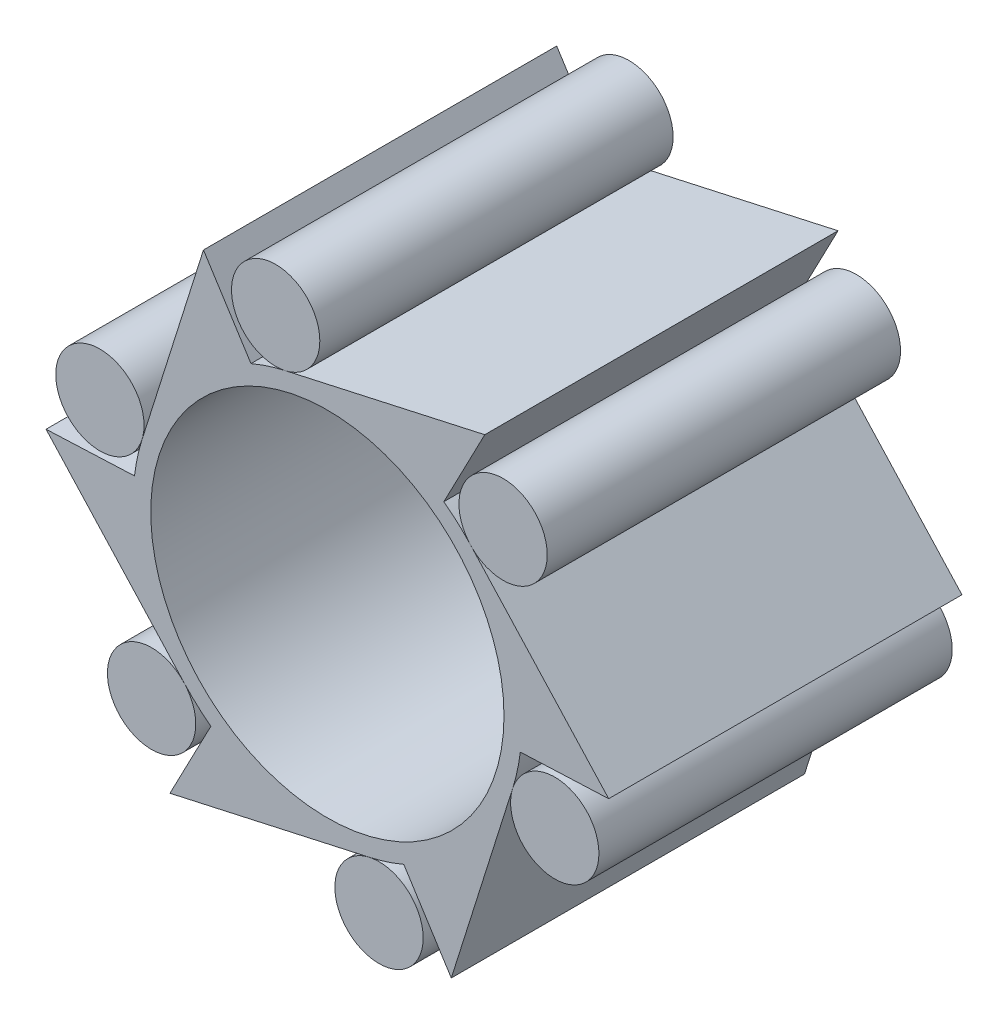
ISO-10303-21;
HEADER;
FILE_DESCRIPTION(('STEP AP214'),'2;1');
FILE_NAME('part.step','',(''),(''),'','','');
FILE_SCHEMA(('AUTOMOTIVE_DESIGN { 1 0 10303 214 1 1 1 1 }'));
ENDSEC;
DATA;
#1=APPLICATION_CONTEXT('core data for automotive mechanical design processes');
#2=APPLICATION_PROTOCOL_DEFINITION('international standard','automotive_design',2000,#1);
#3=PRODUCT_CONTEXT('',#1,'mechanical');
#4=PRODUCT('Part','Part','',(#3));
#5=PRODUCT_RELATED_PRODUCT_CATEGORY('part','',(#4));
#6=PRODUCT_DEFINITION_FORMATION('','',#4);
#7=PRODUCT_DEFINITION_CONTEXT('part definition',#1,'design');
#8=PRODUCT_DEFINITION('design','',#6,#7);
#9=PRODUCT_DEFINITION_SHAPE('','',#8);
#10=(LENGTH_UNIT() NAMED_UNIT(*) SI_UNIT(.MILLI.,.METRE.));
#11=(NAMED_UNIT(*) PLANE_ANGLE_UNIT() SI_UNIT($,.RADIAN.));
#12=(NAMED_UNIT(*) SI_UNIT($,.STERADIAN.) SOLID_ANGLE_UNIT());
#13=UNCERTAINTY_MEASURE_WITH_UNIT(LENGTH_MEASURE(1.E-05),#10,'distance_accuracy_value','');
#14=(GEOMETRIC_REPRESENTATION_CONTEXT(3) GLOBAL_UNCERTAINTY_ASSIGNED_CONTEXT((#13)) GLOBAL_UNIT_ASSIGNED_CONTEXT((#10,
#11,#12)) REPRESENTATION_CONTEXT('',''));
#15=CARTESIAN_POINT('',(0.,0.,0.));
#16=DIRECTION('',(0.,0.,1.));
#17=DIRECTION('',(1.,0.,0.));
#18=AXIS2_PLACEMENT_3D('',#15,#16,#17);
#19=CARTESIAN_POINT('',(-6.43815847656184,2.02795843908887,0.));
#20=DIRECTION('',(0.,0.,1.));
#21=DIRECTION('',(1.,0.,0.));
#22=AXIS2_PLACEMENT_3D('',#19,#20,#21);
#23=CYLINDRICAL_SURFACE('',#22,1.25000000000029);
#24=CARTESIAN_POINT('',(-6.43815847656184,2.02795843908887,0.));
#25=DIRECTION('',(0.,0.,1.));
#26=DIRECTION('',(1.,0.,0.));
#27=AXIS2_PLACEMENT_3D('',#24,#25,#26);
#28=CIRCLE('',#27,1.25000000000029);
#29=CARTESIAN_POINT('',(-5.18815847656156,2.02795843908887,0.));
#30=VERTEX_POINT('',#29);
#31=EDGE_CURVE('E11',#30,#30,#28,.T.);
#32=ORIENTED_EDGE('',*,*,#31,.T.);
#33=EDGE_LOOP('',(#32));
#34=FACE_BOUND('',#33,.T.);
#35=CARTESIAN_POINT('',(-6.43815847656184,2.02795843908887,10.001));
#36=DIRECTION('',(0.,0.,1.));
#37=DIRECTION('',(1.,0.,0.));
#38=AXIS2_PLACEMENT_3D('',#35,#36,#37);
#39=CIRCLE('',#38,1.25000000000029);
#40=CARTESIAN_POINT('',(-5.18815847656156,2.02795843908887,10.001));
#41=VERTEX_POINT('',#40);
#42=EDGE_CURVE('E54',#41,#41,#39,.T.);
#43=ORIENTED_EDGE('',*,*,#42,.F.);
#44=EDGE_LOOP('',(#43));
#45=FACE_BOUND('',#44,.T.);
#46=ADVANCED_FACE('F48',(#34,#45),#23,.T.);
#47=CARTESIAN_POINT('',(-6.43815847656184,2.02795843908887,0.));
#48=DIRECTION('',(0.,0.,1.));
#49=DIRECTION('',(1.,0.,0.));
#50=AXIS2_PLACEMENT_3D('',#47,#48,#49);
#51=PLANE('',#50);
#52=ORIENTED_EDGE('',*,*,#31,.F.);
#53=EDGE_LOOP('',(#52));
#54=FACE_BOUND('',#53,.T.);
#55=ADVANCED_FACE('F63',(#54),#51,.F.);
#56=CARTESIAN_POINT('',(-6.43815847656184,2.02795843908887,10.001));
#57=DIRECTION('',(0.,0.,1.));
#58=DIRECTION('',(1.,0.,0.));
#59=AXIS2_PLACEMENT_3D('',#56,#57,#58);
#60=PLANE('',#59);
#61=ORIENTED_EDGE('',*,*,#42,.T.);
#62=EDGE_LOOP('',(#61));
#63=FACE_BOUND('',#62,.T.);
#64=ADVANCED_FACE('F60',(#63),#60,.T.);
#65=CLOSED_SHELL('',(#46,#55,#64));
#66=MANIFOLD_SOLID_BREP('B2',#65);
#67=CARTESIAN_POINT('',(-4.97534276435067,-4.56162957474852,0.));
#68=DIRECTION('',(0.,0.,1.));
#69=DIRECTION('',(1.,0.,0.));
#70=AXIS2_PLACEMENT_3D('',#67,#68,#69);
#71=CYLINDRICAL_SURFACE('',#70,1.25000000000036);
#72=CARTESIAN_POINT('',(-4.97534276435067,-4.56162957474852,0.));
#73=DIRECTION('',(0.,0.,1.));
#74=DIRECTION('',(1.,0.,0.));
#75=AXIS2_PLACEMENT_3D('',#72,#73,#74);
#76=CIRCLE('',#75,1.25000000000036);
#77=CARTESIAN_POINT('',(-3.72534276435031,-4.56162957474852,0.));
#78=VERTEX_POINT('',#77);
#79=EDGE_CURVE('E47',#78,#78,#76,.T.);
#80=ORIENTED_EDGE('',*,*,#79,.T.);
#81=EDGE_LOOP('',(#80));
#82=FACE_BOUND('',#81,.T.);
#83=CARTESIAN_POINT('',(-4.97534276435067,-4.56162957474852,10.001));
#84=DIRECTION('',(0.,0.,1.));
#85=DIRECTION('',(1.,0.,0.));
#86=AXIS2_PLACEMENT_3D('',#83,#84,#85);
#87=CIRCLE('',#86,1.25000000000036);
#88=CARTESIAN_POINT('',(-3.72534276435031,-4.56162957474852,10.001));
#89=VERTEX_POINT('',#88);
#90=EDGE_CURVE('E103',#89,#89,#87,.T.);
#91=ORIENTED_EDGE('',*,*,#90,.F.);
#92=EDGE_LOOP('',(#91));
#93=FACE_BOUND('',#92,.T.);
#94=ADVANCED_FACE('F97',(#82,#93),#71,.T.);
#95=CARTESIAN_POINT('',(-4.97534276435067,-4.56162957474852,0.));
#96=DIRECTION('',(0.,0.,1.));
#97=DIRECTION('',(1.,0.,0.));
#98=AXIS2_PLACEMENT_3D('',#95,#96,#97);
#99=PLANE('',#98);
#100=ORIENTED_EDGE('',*,*,#79,.F.);
#101=EDGE_LOOP('',(#100));
#102=FACE_BOUND('',#101,.T.);
#103=ADVANCED_FACE('F112',(#102),#99,.F.);
#104=CARTESIAN_POINT('',(-4.97534276435067,-4.56162957474852,10.001));
#105=DIRECTION('',(0.,0.,1.));
#106=DIRECTION('',(1.,0.,0.));
#107=AXIS2_PLACEMENT_3D('',#104,#105,#106);
#108=PLANE('',#107);
#109=ORIENTED_EDGE('',*,*,#90,.T.);
#110=EDGE_LOOP('',(#109));
#111=FACE_BOUND('',#110,.T.);
#112=ADVANCED_FACE('F109',(#111),#108,.T.);
#113=CLOSED_SHELL('',(#94,#103,#112));
#114=MANIFOLD_SOLID_BREP('B6',#113);
#115=CARTESIAN_POINT('',(1.46281571221154,-6.58958801383732,0.));
#116=DIRECTION('',(0.,0.,1.));
#117=DIRECTION('',(1.,0.,0.));
#118=AXIS2_PLACEMENT_3D('',#115,#116,#117);
#119=CYLINDRICAL_SURFACE('',#118,1.25000000000007);
#120=CARTESIAN_POINT('',(1.46281571221154,-6.58958801383732,0.));
#121=DIRECTION('',(0.,0.,1.));
#122=DIRECTION('',(1.,0.,0.));
#123=AXIS2_PLACEMENT_3D('',#120,#121,#122);
#124=CIRCLE('',#123,1.25000000000007);
#125=CARTESIAN_POINT('',(2.71281571221161,-6.58958801383732,0.));
#126=VERTEX_POINT('',#125);
#127=EDGE_CURVE('E96',#126,#126,#124,.T.);
#128=ORIENTED_EDGE('',*,*,#127,.T.);
#129=EDGE_LOOP('',(#128));
#130=FACE_BOUND('',#129,.T.);
#131=CARTESIAN_POINT('',(1.46281571221154,-6.58958801383732,10.001));
#132=DIRECTION('',(0.,0.,1.));
#133=DIRECTION('',(1.,0.,0.));
#134=AXIS2_PLACEMENT_3D('',#131,#132,#133);
#135=CIRCLE('',#134,1.25000000000007);
#136=CARTESIAN_POINT('',(2.71281571221161,-6.58958801383732,10.001));
#137=VERTEX_POINT('',#136);
#138=EDGE_CURVE('E152',#137,#137,#135,.T.);
#139=ORIENTED_EDGE('',*,*,#138,.F.);
#140=EDGE_LOOP('',(#139));
#141=FACE_BOUND('',#140,.T.);
#142=ADVANCED_FACE('F146',(#130,#141),#119,.T.);
#143=CARTESIAN_POINT('',(1.46281571221154,-6.58958801383732,0.));
#144=DIRECTION('',(0.,0.,1.));
#145=DIRECTION('',(1.,0.,0.));
#146=AXIS2_PLACEMENT_3D('',#143,#144,#145);
#147=PLANE('',#146);
#148=ORIENTED_EDGE('',*,*,#127,.F.);
#149=EDGE_LOOP('',(#148));
#150=FACE_BOUND('',#149,.T.);
#151=ADVANCED_FACE('F161',(#150),#147,.F.);
#152=CARTESIAN_POINT('',(1.46281571221154,-6.58958801383732,10.001));
#153=DIRECTION('',(0.,0.,1.));
#154=DIRECTION('',(1.,0.,0.));
#155=AXIS2_PLACEMENT_3D('',#152,#153,#154);
#156=PLANE('',#155);
#157=ORIENTED_EDGE('',*,*,#138,.T.);
#158=EDGE_LOOP('',(#157));
#159=FACE_BOUND('',#158,.T.);
#160=ADVANCED_FACE('F158',(#159),#156,.T.);
#161=CLOSED_SHELL('',(#142,#151,#160));
#162=MANIFOLD_SOLID_BREP('B42',#161);
#163=CARTESIAN_POINT('',(6.43815847656259,-2.02795843908872,0.));
#164=DIRECTION('',(0.,0.,1.));
#165=DIRECTION('',(1.,0.,0.));
#166=AXIS2_PLACEMENT_3D('',#163,#164,#165);
#167=CYLINDRICAL_SURFACE('',#166,1.24999999999971);
#168=CARTESIAN_POINT('',(6.43815847656259,-2.02795843908872,0.));
#169=DIRECTION('',(0.,0.,1.));
#170=DIRECTION('',(1.,0.,0.));
#171=AXIS2_PLACEMENT_3D('',#168,#169,#170);
#172=CIRCLE('',#171,1.24999999999971);
#173=CARTESIAN_POINT('',(7.6881584765623,-2.02795843908872,0.));
#174=VERTEX_POINT('',#173);
#175=EDGE_CURVE('E145',#174,#174,#172,.T.);
#176=ORIENTED_EDGE('',*,*,#175,.T.);
#177=EDGE_LOOP('',(#176));
#178=FACE_BOUND('',#177,.T.);
#179=CARTESIAN_POINT('',(6.43815847656259,-2.02795843908872,10.001));
#180=DIRECTION('',(0.,0.,1.));
#181=DIRECTION('',(1.,0.,0.));
#182=AXIS2_PLACEMENT_3D('',#179,#180,#181);
#183=CIRCLE('',#182,1.24999999999971);
#184=CARTESIAN_POINT('',(7.6881584765623,-2.02795843908872,10.001));
#185=VERTEX_POINT('',#184);
#186=EDGE_CURVE('E201',#185,#185,#183,.T.);
#187=ORIENTED_EDGE('',*,*,#186,.F.);
#188=EDGE_LOOP('',(#187));
#189=FACE_BOUND('',#188,.T.);
#190=ADVANCED_FACE('F195',(#178,#189),#167,.T.);
#191=CARTESIAN_POINT('',(6.43815847656259,-2.02795843908872,0.));
#192=DIRECTION('',(0.,0.,1.));
#193=DIRECTION('',(1.,0.,0.));
#194=AXIS2_PLACEMENT_3D('',#191,#192,#193);
#195=PLANE('',#194);
#196=ORIENTED_EDGE('',*,*,#175,.F.);
#197=EDGE_LOOP('',(#196));
#198=FACE_BOUND('',#197,.T.);
#199=ADVANCED_FACE('F210',(#198),#195,.F.);
#200=CARTESIAN_POINT('',(6.43815847656259,-2.02795843908872,10.001));
#201=DIRECTION('',(0.,0.,1.));
#202=DIRECTION('',(1.,0.,0.));
#203=AXIS2_PLACEMENT_3D('',#200,#201,#202);
#204=PLANE('',#203);
#205=ORIENTED_EDGE('',*,*,#186,.T.);
#206=EDGE_LOOP('',(#205));
#207=FACE_BOUND('',#206,.T.);
#208=ADVANCED_FACE('F207',(#207),#204,.T.);
#209=CLOSED_SHELL('',(#190,#199,#208));
#210=MANIFOLD_SOLID_BREP('B91',#209);
#211=CARTESIAN_POINT('',(4.97534276435142,4.56162957474868,0.));
#212=DIRECTION('',(0.,0.,1.));
#213=DIRECTION('',(1.,0.,0.));
#214=AXIS2_PLACEMENT_3D('',#211,#212,#213);
#215=CYLINDRICAL_SURFACE('',#214,1.24999999999962);
#216=CARTESIAN_POINT('',(4.97534276435142,4.56162957474868,0.));
#217=DIRECTION('',(0.,0.,1.));
#218=DIRECTION('',(1.,0.,0.));
#219=AXIS2_PLACEMENT_3D('',#216,#217,#218);
#220=CIRCLE('',#219,1.24999999999962);
#221=CARTESIAN_POINT('',(6.22534276435104,4.56162957474868,0.));
#222=VERTEX_POINT('',#221);
#223=EDGE_CURVE('E194',#222,#222,#220,.T.);
#224=ORIENTED_EDGE('',*,*,#223,.T.);
#225=EDGE_LOOP('',(#224));
#226=FACE_BOUND('',#225,.T.);
#227=CARTESIAN_POINT('',(4.97534276435142,4.56162957474868,10.001));
#228=DIRECTION('',(0.,0.,1.));
#229=DIRECTION('',(1.,0.,0.));
#230=AXIS2_PLACEMENT_3D('',#227,#228,#229);
#231=CIRCLE('',#230,1.24999999999962);
#232=CARTESIAN_POINT('',(6.22534276435104,4.56162957474868,10.001));
#233=VERTEX_POINT('',#232);
#234=EDGE_CURVE('E250',#233,#233,#231,.T.);
#235=ORIENTED_EDGE('',*,*,#234,.F.);
#236=EDGE_LOOP('',(#235));
#237=FACE_BOUND('',#236,.T.);
#238=ADVANCED_FACE('F244',(#226,#237),#215,.T.);
#239=CARTESIAN_POINT('',(4.97534276435142,4.56162957474868,0.));
#240=DIRECTION('',(0.,0.,1.));
#241=DIRECTION('',(1.,0.,0.));
#242=AXIS2_PLACEMENT_3D('',#239,#240,#241);
#243=PLANE('',#242);
#244=ORIENTED_EDGE('',*,*,#223,.F.);
#245=EDGE_LOOP('',(#244));
#246=FACE_BOUND('',#245,.T.);
#247=ADVANCED_FACE('F259',(#246),#243,.F.);
#248=CARTESIAN_POINT('',(4.97534276435142,4.56162957474868,10.001));
#249=DIRECTION('',(0.,0.,1.));
#250=DIRECTION('',(1.,0.,0.));
#251=AXIS2_PLACEMENT_3D('',#248,#249,#250);
#252=PLANE('',#251);
#253=ORIENTED_EDGE('',*,*,#234,.T.);
#254=EDGE_LOOP('',(#253));
#255=FACE_BOUND('',#254,.T.);
#256=ADVANCED_FACE('F256',(#255),#252,.T.);
#257=CLOSED_SHELL('',(#238,#247,#256));
#258=MANIFOLD_SOLID_BREP('B140',#257);
#259=CARTESIAN_POINT('',(-1.46281571221079,6.58958801383748,0.));
#260=DIRECTION('',(0.,0.,1.));
#261=DIRECTION('',(1.,0.,0.));
#262=AXIS2_PLACEMENT_3D('',#259,#260,#261);
#263=CYLINDRICAL_SURFACE('',#262,1.24999999999991);
#264=CARTESIAN_POINT('',(-1.46281571221079,6.58958801383748,0.));
#265=DIRECTION('',(0.,0.,1.));
#266=DIRECTION('',(1.,0.,0.));
#267=AXIS2_PLACEMENT_3D('',#264,#265,#266);
#268=CIRCLE('',#267,1.24999999999991);
#269=CARTESIAN_POINT('',(-0.212815712210889,6.58958801383748,0.));
#270=VERTEX_POINT('',#269);
#271=EDGE_CURVE('E243',#270,#270,#268,.T.);
#272=ORIENTED_EDGE('',*,*,#271,.T.);
#273=EDGE_LOOP('',(#272));
#274=FACE_BOUND('',#273,.T.);
#275=CARTESIAN_POINT('',(-1.46281571221079,6.58958801383748,10.001));
#276=DIRECTION('',(0.,0.,1.));
#277=DIRECTION('',(1.,0.,0.));
#278=AXIS2_PLACEMENT_3D('',#275,#276,#277);
#279=CIRCLE('',#278,1.24999999999991);
#280=CARTESIAN_POINT('',(-0.212815712210889,6.58958801383748,10.001));
#281=VERTEX_POINT('',#280);
#282=EDGE_CURVE('E300',#281,#281,#279,.T.);
#283=ORIENTED_EDGE('',*,*,#282,.F.);
#284=EDGE_LOOP('',(#283));
#285=FACE_BOUND('',#284,.T.);
#286=ADVANCED_FACE('F294',(#274,#285),#263,.T.);
#287=CARTESIAN_POINT('',(-1.46281571221079,6.58958801383748,0.));
#288=DIRECTION('',(0.,0.,1.));
#289=DIRECTION('',(1.,0.,0.));
#290=AXIS2_PLACEMENT_3D('',#287,#288,#289);
#291=PLANE('',#290);
#292=ORIENTED_EDGE('',*,*,#271,.F.);
#293=EDGE_LOOP('',(#292));
#294=FACE_BOUND('',#293,.T.);
#295=ADVANCED_FACE('F309',(#294),#291,.F.);
#296=CARTESIAN_POINT('',(-1.46281571221079,6.58958801383748,10.001));
#297=DIRECTION('',(0.,0.,1.));
#298=DIRECTION('',(1.,0.,0.));
#299=AXIS2_PLACEMENT_3D('',#296,#297,#298);
#300=PLANE('',#299);
#301=ORIENTED_EDGE('',*,*,#282,.T.);
#302=EDGE_LOOP('',(#301));
#303=FACE_BOUND('',#302,.T.);
#304=ADVANCED_FACE('F306',(#303),#300,.T.);
#305=CLOSED_SHELL('',(#286,#295,#304));
#306=MANIFOLD_SOLID_BREP('B189',#305);
#307=CARTESIAN_POINT('',(-4.0539829931751,-3.71688335720225,10.));
#308=DIRECTION('',(-0.737087816940927,-0.675796974036773,0.));
#309=DIRECTION('',(0.675796974036773,-0.737087816940927,0.));
#310=AXIS2_PLACEMENT_3D('',#307,#308,#309);
#311=PLANE('',#310);
#312=DIRECTION('',(-0.675796974036773,0.737087816940927,0.));
#313=VECTOR('',#312,1.);
#314=CARTESIAN_POINT('',(-4.0539829931751,-3.71688335720225,0.));
#315=LINE('',#314,#313);
#316=CARTESIAN_POINT('',(-4.0539829931747,-3.71688335720269,0.));
#317=VERTEX_POINT('',#316);
#318=CARTESIAN_POINT('',(-7.96363468894539,0.547350938226694,0.));
#319=VERTEX_POINT('',#318);
#320=EDGE_CURVE('E502',#317,#319,#315,.T.);
#321=ORIENTED_EDGE('',*,*,#320,.F.);
#322=DIRECTION('',(0.,0.,-1.));
#323=VECTOR('',#322,1.);
#324=CARTESIAN_POINT('',(-4.0539829931747,-3.71688335720269,10.));
#325=LINE('',#324,#323);
#326=CARTESIAN_POINT('',(-4.0539829931747,-3.71688335720269,10.));
#327=VERTEX_POINT('',#326);
#328=EDGE_CURVE('E292',#327,#317,#325,.T.);
#329=ORIENTED_EDGE('',*,*,#328,.F.);
#330=DIRECTION('',(-0.675796974036773,0.737087816940927,0.));
#331=VECTOR('',#330,1.);
#332=CARTESIAN_POINT('',(-4.0539829931751,-3.71688335720225,10.));
#333=LINE('',#332,#331);
#334=CARTESIAN_POINT('',(-7.96363468894539,0.547350938226694,10.));
#335=VERTEX_POINT('',#334);
#336=EDGE_CURVE('E560',#327,#335,#333,.T.);
#337=ORIENTED_EDGE('',*,*,#336,.T.);
#338=DIRECTION('',(0.,0.,-1.));
#339=VECTOR('',#338,1.);
#340=CARTESIAN_POINT('',(-7.96363468894539,0.547350938226694,10.));
#341=LINE('',#340,#339);
#342=EDGE_CURVE('E352',#335,#319,#341,.T.);
#343=ORIENTED_EDGE('',*,*,#342,.T.);
#344=EDGE_LOOP('',(#321,#329,#337,#343));
#345=FACE_BOUND('',#344,.T.);
#346=ADVANCED_FACE('F335',(#345),#311,.T.);
#347=CARTESIAN_POINT('',(0.,0.,10.));
#348=DIRECTION('',(0.,0.,-1.));
#349=DIRECTION('',(-1.,0.,0.));
#350=AXIS2_PLACEMENT_3D('',#347,#348,#349);
#351=CYLINDRICAL_SURFACE('',#350,5.5);
#352=CARTESIAN_POINT('',(0.,0.,0.));
#353=DIRECTION('',(0.,0.,1.));
#354=DIRECTION('',(1.,0.,0.));
#355=AXIS2_PLACEMENT_3D('',#352,#353,#354);
#356=CIRCLE('',#355,5.5);
#357=CARTESIAN_POINT('',(-3.29771802857338,-4.40171055432098,0.));
#358=VERTEX_POINT('',#357);
#359=EDGE_CURVE('E505',#317,#358,#356,.T.);
#360=ORIENTED_EDGE('',*,*,#359,.T.);
#361=DIRECTION('',(0.,0.,-1.));
#362=VECTOR('',#361,1.);
#363=CARTESIAN_POINT('',(-3.29771802857338,-4.40171055432098,10.));
#364=LINE('',#363,#362);
#365=CARTESIAN_POINT('',(-3.29771802857338,-4.40171055432098,10.));
#366=VERTEX_POINT('',#365);
#367=EDGE_CURVE('E344',#366,#358,#364,.T.);
#368=ORIENTED_EDGE('',*,*,#367,.F.);
#369=CARTESIAN_POINT('',(0.,0.,10.));
#370=DIRECTION('',(0.,0.,1.));
#371=DIRECTION('',(1.,0.,0.));
#372=AXIS2_PLACEMENT_3D('',#369,#370,#371);
#373=CIRCLE('',#372,5.5);
#374=EDGE_CURVE('E483',#327,#366,#373,.T.);
#375=ORIENTED_EDGE('',*,*,#374,.F.);
#376=ORIENTED_EDGE('',*,*,#328,.T.);
#377=EDGE_LOOP('',(#360,#368,#375,#376));
#378=FACE_BOUND('',#377,.T.);
#379=ADVANCED_FACE('F612',(#378),#351,.T.);
#380=CARTESIAN_POINT('',(-0.78849395166829,0.411092647095519,10.));
#381=DIRECTION('',(-0.886721090950614,0.462304777028481,0.));
#382=DIRECTION('',(-0.462304777028481,-0.886721090950614,0.));
#383=AXIS2_PLACEMENT_3D('',#380,#381,#382);
#384=PLANE('',#383);
#385=DIRECTION('',(0.462304777028481,0.886721090950614,0.));
#386=VECTOR('',#385,1.);
#387=CARTESIAN_POINT('',(-0.78849395166829,0.411092647095519,0.));
#388=LINE('',#387,#386);
#389=CARTESIAN_POINT('',(-4.455837161762,-6.62303447797263,0.));
#390=VERTEX_POINT('',#389);
#391=EDGE_CURVE('E509',#390,#358,#388,.T.);
#392=ORIENTED_EDGE('',*,*,#391,.F.);
#393=DIRECTION('',(0.,0.,-1.));
#394=VECTOR('',#393,1.);
#395=CARTESIAN_POINT('',(-4.455837161762,-6.62303447797263,10.));
#396=LINE('',#395,#394);
#397=CARTESIAN_POINT('',(-4.455837161762,-6.62303447797263,10.));
#398=VERTEX_POINT('',#397);
#399=EDGE_CURVE('E600',#398,#390,#396,.T.);
#400=ORIENTED_EDGE('',*,*,#399,.F.);
#401=DIRECTION('',(0.462304777028481,0.886721090950614,0.));
#402=VECTOR('',#401,1.);
#403=CARTESIAN_POINT('',(-0.78849395166829,0.411092647095519,10.));
#404=LINE('',#403,#402);
#405=EDGE_CURVE('E609',#398,#366,#404,.T.);
#406=ORIENTED_EDGE('',*,*,#405,.T.);
#407=ORIENTED_EDGE('',*,*,#367,.T.);
#408=EDGE_LOOP('',(#392,#400,#406,#407));
#409=FACE_BOUND('',#408,.T.);
#410=ADVANCED_FACE('F607',(#409),#384,.T.);
#411=CARTESIAN_POINT('',(1.19192391365326,-5.36929393720117,10.));
#412=DIRECTION('',(0.216713438846034,-0.976235261309243,0.));
#413=DIRECTION('',(0.976235261309243,0.216713438846034,0.));
#414=AXIS2_PLACEMENT_3D('',#411,#412,#413);
#415=PLANE('',#414);
#416=DIRECTION('',(-0.976235261309243,-0.216713438846034,0.));
#417=VECTOR('',#416,1.);
#418=CARTESIAN_POINT('',(1.19192391365326,-5.36929393720117,0.));
#419=LINE('',#418,#417);
#420=CARTESIAN_POINT('',(1.19192391365399,-5.36929393720083,0.));
#421=VERTEX_POINT('',#420);
#422=EDGE_CURVE('E515',#421,#390,#419,.T.);
#423=ORIENTED_EDGE('',*,*,#422,.F.);
#424=DIRECTION('',(0.,0.,-1.));
#425=VECTOR('',#424,1.);
#426=CARTESIAN_POINT('',(1.19192391365399,-5.36929393720083,10.));
#427=LINE('',#426,#425);
#428=CARTESIAN_POINT('',(1.19192391365399,-5.36929393720083,10.));
#429=VERTEX_POINT('',#428);
#430=EDGE_CURVE('E597',#429,#421,#427,.T.);
#431=ORIENTED_EDGE('',*,*,#430,.F.);
#432=DIRECTION('',(-0.976235261309243,-0.216713438846034,0.));
#433=VECTOR('',#432,1.);
#434=CARTESIAN_POINT('',(1.19192391365326,-5.36929393720117,10.));
#435=LINE('',#434,#433);
#436=EDGE_CURVE('E624',#429,#398,#435,.T.);
#437=ORIENTED_EDGE('',*,*,#436,.T.);
#438=ORIENTED_EDGE('',*,*,#399,.T.);
#439=EDGE_LOOP('',(#423,#431,#437,#438));
#440=FACE_BOUND('',#439,.T.);
#441=ADVANCED_FACE('F620',(#440),#415,.T.);
#442=CARTESIAN_POINT('',(2.16313414586155,-5.0567628644231,0.));
#443=VERTEX_POINT('',#442);
#444=EDGE_CURVE('E511',#421,#443,#356,.T.);
#445=ORIENTED_EDGE('',*,*,#444,.T.);
#446=DIRECTION('',(0.,0.,-1.));
#447=VECTOR('',#446,1.);
#448=CARTESIAN_POINT('',(2.16313414586155,-5.0567628644231,10.));
#449=LINE('',#448,#447);
#450=CARTESIAN_POINT('',(2.16313414586155,-5.0567628644231,10.));
#451=VERTEX_POINT('',#450);
#452=EDGE_CURVE('E594',#451,#443,#449,.T.);
#453=ORIENTED_EDGE('',*,*,#452,.F.);
#454=EDGE_CURVE('E629',#429,#451,#373,.T.);
#455=ORIENTED_EDGE('',*,*,#454,.F.);
#456=ORIENTED_EDGE('',*,*,#430,.T.);
#457=EDGE_LOOP('',(#445,#453,#455,#456));
#458=FACE_BOUND('',#457,.T.);
#459=ADVANCED_FACE('F676',(#458),#351,.T.);
#460=CARTESIAN_POINT('',(-0.750263651527799,-0.477309469327323,10.));
#461=DIRECTION('',(-0.843728226672872,-0.536770602320443,0.));
#462=DIRECTION('',(0.536770602320443,-0.843728226672872,0.));
#463=AXIS2_PLACEMENT_3D('',#460,#461,#462);
#464=PLANE('',#463);
#465=DIRECTION('',(-0.536770602320443,0.843728226672872,0.));
#466=VECTOR('',#465,1.);
#467=CARTESIAN_POINT('',(-0.750263651527799,-0.477309469327323,0.));
#468=LINE('',#467,#466);
#469=CARTESIAN_POINT('',(3.50779752718377,-7.17038541619925,0.));
#470=VERTEX_POINT('',#469);
#471=EDGE_CURVE('E519',#470,#443,#468,.T.);
#472=ORIENTED_EDGE('',*,*,#471,.F.);
#473=DIRECTION('',(0.,0.,-1.));
#474=VECTOR('',#473,1.);
#475=CARTESIAN_POINT('',(3.50779752718377,-7.17038541619925,10.));
#476=LINE('',#475,#474);
#477=CARTESIAN_POINT('',(3.50779752718377,-7.17038541619925,10.));
#478=VERTEX_POINT('',#477);
#479=EDGE_CURVE('E591',#478,#470,#476,.T.);
#480=ORIENTED_EDGE('',*,*,#479,.F.);
#481=DIRECTION('',(-0.536770602320443,0.843728226672872,0.));
#482=VECTOR('',#481,1.);
#483=CARTESIAN_POINT('',(-0.750263651527799,-0.477309469327323,10.));
#484=LINE('',#483,#482);
#485=EDGE_CURVE('E633',#478,#451,#484,.T.);
#486=ORIENTED_EDGE('',*,*,#485,.T.);
#487=ORIENTED_EDGE('',*,*,#452,.T.);
#488=EDGE_LOOP('',(#472,#480,#486,#487));
#489=FACE_BOUND('',#488,.T.);
#490=ADVANCED_FACE('F679',(#489),#464,.T.);
#491=CARTESIAN_POINT('',(5.24590690682894,-1.65241057999879,10.));
#492=DIRECTION('',(0.953801255786961,-0.300438287272471,0.));
#493=DIRECTION('',(0.300438287272471,0.953801255786961,0.));
#494=AXIS2_PLACEMENT_3D('',#491,#492,#493);
#495=PLANE('',#494);
#496=DIRECTION('',(-0.300438287272471,-0.953801255786961,0.));
#497=VECTOR('',#496,1.);
#498=CARTESIAN_POINT('',(5.24590690682894,-1.65241057999879,0.));
#499=LINE('',#498,#497);
#500=CARTESIAN_POINT('',(5.24590690682879,-1.65241057999813,0.));
#501=VERTEX_POINT('',#500);
#502=EDGE_CURVE('E523',#501,#470,#499,.T.);
#503=ORIENTED_EDGE('',*,*,#502,.F.);
#504=DIRECTION('',(0.,0.,-1.));
#505=VECTOR('',#504,1.);
#506=CARTESIAN_POINT('',(5.24590690682879,-1.65241057999813,10.));
#507=LINE('',#506,#505);
#508=CARTESIAN_POINT('',(5.24590690682879,-1.65241057999813,10.));
#509=VERTEX_POINT('',#508);
#510=EDGE_CURVE('E588',#509,#501,#507,.T.);
#511=ORIENTED_EDGE('',*,*,#510,.F.);
#512=DIRECTION('',(-0.300438287272471,-0.953801255786961,0.));
#513=VECTOR('',#512,1.);
#514=CARTESIAN_POINT('',(5.24590690682894,-1.65241057999879,10.));
#515=LINE('',#514,#513);
#516=EDGE_CURVE('E637',#509,#478,#515,.T.);
#517=ORIENTED_EDGE('',*,*,#516,.T.);
#518=ORIENTED_EDGE('',*,*,#479,.T.);
#519=EDGE_LOOP('',(#503,#511,#517,#518));
#520=FACE_BOUND('',#519,.T.);
#521=ADVANCED_FACE('F682',(#520),#495,.T.);
#522=CARTESIAN_POINT('',(5.46085217443506,-0.655052310102165,0.));
#523=VERTEX_POINT('',#522);
#524=EDGE_CURVE('E527',#501,#523,#356,.T.);
#525=ORIENTED_EDGE('',*,*,#524,.T.);
#526=DIRECTION('',(0.,0.,-1.));
#527=VECTOR('',#526,1.);
#528=CARTESIAN_POINT('',(5.46085217443506,-0.655052310102165,10.));
#529=LINE('',#528,#527);
#530=CARTESIAN_POINT('',(5.46085217443506,-0.655052310102165,10.));
#531=VERTEX_POINT('',#530);
#532=EDGE_CURVE('E585',#531,#523,#529,.T.);
#533=ORIENTED_EDGE('',*,*,#532,.F.);
#534=EDGE_CURVE('E641',#509,#531,#373,.T.);
#535=ORIENTED_EDGE('',*,*,#534,.F.);
#536=ORIENTED_EDGE('',*,*,#510,.T.);
#537=EDGE_LOOP('',(#525,#533,#535,#536));
#538=FACE_BOUND('',#537,.T.);
#539=ADVANCED_FACE('F686',(#538),#351,.T.);
#540=CARTESIAN_POINT('',(0.0382303001404442,-0.888402116423111,10.));
#541=DIRECTION('',(0.042992864277742,-0.999075379348924,0.));
#542=DIRECTION('',(0.999075379348924,0.042992864277742,0.));
#543=AXIS2_PLACEMENT_3D('',#540,#541,#542);
#544=PLANE('',#543);
#545=DIRECTION('',(-0.999075379348924,-0.042992864277742,0.));
#546=VECTOR('',#545,1.);
#547=CARTESIAN_POINT('',(0.0382303001404442,-0.888402116423111,0.));
#548=LINE('',#547,#546);
#549=CARTESIAN_POINT('',(7.96363468894615,-0.547350938226533,0.));
#550=VERTEX_POINT('',#549);
#551=EDGE_CURVE('E528',#550,#523,#548,.T.);
#552=ORIENTED_EDGE('',*,*,#551,.F.);
#553=DIRECTION('',(0.,0.,-1.));
#554=VECTOR('',#553,1.);
#555=CARTESIAN_POINT('',(7.96363468894615,-0.547350938226533,10.));
#556=LINE('',#555,#554);
#557=CARTESIAN_POINT('',(7.96363468894615,-0.547350938226533,10.));
#558=VERTEX_POINT('',#557);
#559=EDGE_CURVE('E582',#558,#550,#556,.T.);
#560=ORIENTED_EDGE('',*,*,#559,.F.);
#561=DIRECTION('',(-0.999075379348924,-0.042992864277742,0.));
#562=VECTOR('',#561,1.);
#563=CARTESIAN_POINT('',(0.0382303001404442,-0.888402116423111,10.));
#564=LINE('',#563,#562);
#565=EDGE_CURVE('E642',#558,#531,#564,.T.);
#566=ORIENTED_EDGE('',*,*,#565,.T.);
#567=ORIENTED_EDGE('',*,*,#532,.T.);
#568=EDGE_LOOP('',(#552,#560,#566,#567));
#569=FACE_BOUND('',#568,.T.);
#570=ADVANCED_FACE('F689',(#569),#544,.T.);
#571=CARTESIAN_POINT('',(4.0539829931756,3.71688335720271,10.));
#572=DIRECTION('',(0.737087816940927,0.675796974036773,0.));
#573=DIRECTION('',(-0.675796974036773,0.737087816940927,0.));
#574=AXIS2_PLACEMENT_3D('',#571,#572,#573);
#575=PLANE('',#574);
#576=DIRECTION('',(0.675796974036773,-0.737087816940927,0.));
#577=VECTOR('',#576,1.);
#578=CARTESIAN_POINT('',(4.0539829931756,3.71688335720271,0.));
#579=LINE('',#578,#577);
#580=CARTESIAN_POINT('',(4.05398299317521,3.71688335720263,0.));
#581=VERTEX_POINT('',#580);
#582=EDGE_CURVE('E532',#581,#550,#579,.T.);
#583=ORIENTED_EDGE('',*,*,#582,.F.);
#584=DIRECTION('',(0.,0.,-1.));
#585=VECTOR('',#584,1.);
#586=CARTESIAN_POINT('',(4.05398299317521,3.71688335720263,10.));
#587=LINE('',#586,#585);
#588=CARTESIAN_POINT('',(4.05398299317521,3.71688335720263,10.));
#589=VERTEX_POINT('',#588);
#590=EDGE_CURVE('E579',#589,#581,#587,.T.);
#591=ORIENTED_EDGE('',*,*,#590,.F.);
#592=DIRECTION('',(0.675796974036773,-0.737087816940927,0.));
#593=VECTOR('',#592,1.);
#594=CARTESIAN_POINT('',(4.0539829931756,3.71688335720271,10.));
#595=LINE('',#594,#593);
#596=EDGE_CURVE('E646',#589,#558,#595,.T.);
#597=ORIENTED_EDGE('',*,*,#596,.T.);
#598=ORIENTED_EDGE('',*,*,#559,.T.);
#599=EDGE_LOOP('',(#583,#591,#597,#598));
#600=FACE_BOUND('',#599,.T.);
#601=ADVANCED_FACE('F692',(#600),#575,.T.);
#602=CARTESIAN_POINT('',(3.29771802857397,4.40171055432091,0.));
#603=VERTEX_POINT('',#602);
#604=EDGE_CURVE('E536',#581,#603,#356,.T.);
#605=ORIENTED_EDGE('',*,*,#604,.T.);
#606=DIRECTION('',(0.,0.,-1.));
#607=VECTOR('',#606,1.);
#608=CARTESIAN_POINT('',(3.29771802857397,4.40171055432091,10.));
#609=LINE('',#608,#607);
#610=CARTESIAN_POINT('',(3.29771802857397,4.40171055432091,10.));
#611=VERTEX_POINT('',#610);
#612=EDGE_CURVE('E576',#611,#603,#609,.T.);
#613=ORIENTED_EDGE('',*,*,#612,.F.);
#614=EDGE_CURVE('E650',#589,#611,#373,.T.);
#615=ORIENTED_EDGE('',*,*,#614,.F.);
#616=ORIENTED_EDGE('',*,*,#590,.T.);
#617=EDGE_LOOP('',(#605,#613,#615,#616));
#618=FACE_BOUND('',#617,.T.);
#619=ADVANCED_FACE('F696',(#618),#351,.T.);
#620=CARTESIAN_POINT('',(0.788493951668819,-0.411092647095795,10.));
#621=DIRECTION('',(0.886721090950614,-0.462304777028481,0.));
#622=DIRECTION('',(0.462304777028481,0.886721090950614,0.));
#623=AXIS2_PLACEMENT_3D('',#620,#621,#622);
#624=PLANE('',#623);
#625=DIRECTION('',(-0.462304777028481,-0.886721090950614,0.));
#626=VECTOR('',#625,1.);
#627=CARTESIAN_POINT('',(0.788493951668819,-0.411092647095795,0.));
#628=LINE('',#627,#626);
#629=CARTESIAN_POINT('',(4.45583716176276,6.6230344779728,0.));
#630=VERTEX_POINT('',#629);
#631=EDGE_CURVE('E537',#630,#603,#628,.T.);
#632=ORIENTED_EDGE('',*,*,#631,.F.);
#633=DIRECTION('',(0.,0.,-1.));
#634=VECTOR('',#633,1.);
#635=CARTESIAN_POINT('',(4.45583716176276,6.6230344779728,10.));
#636=LINE('',#635,#634);
#637=CARTESIAN_POINT('',(4.45583716176276,6.6230344779728,10.));
#638=VERTEX_POINT('',#637);
#639=EDGE_CURVE('E573',#638,#630,#636,.T.);
#640=ORIENTED_EDGE('',*,*,#639,.F.);
#641=DIRECTION('',(-0.462304777028481,-0.886721090950614,0.));
#642=VECTOR('',#641,1.);
#643=CARTESIAN_POINT('',(0.788493951668819,-0.411092647095795,10.));
#644=LINE('',#643,#642);
#645=EDGE_CURVE('E651',#638,#611,#644,.T.);
#646=ORIENTED_EDGE('',*,*,#645,.T.);
#647=ORIENTED_EDGE('',*,*,#612,.T.);
#648=EDGE_LOOP('',(#632,#640,#646,#647));
#649=FACE_BOUND('',#648,.T.);
#650=ADVANCED_FACE('F699',(#649),#624,.T.);
#651=CARTESIAN_POINT('',(-1.19192391365326,5.36929393720117,10.));
#652=DIRECTION('',(-0.216713438846034,0.976235261309243,0.));
#653=DIRECTION('',(-0.976235261309243,-0.216713438846034,0.));
#654=AXIS2_PLACEMENT_3D('',#651,#652,#653);
#655=PLANE('',#654);
#656=DIRECTION('',(0.976235261309243,0.216713438846034,0.));
#657=VECTOR('',#656,1.);
#658=CARTESIAN_POINT('',(-1.19192391365326,5.36929393720117,0.));
#659=LINE('',#658,#657);
#660=CARTESIAN_POINT('',(-1.19192391365323,5.369293937201,0.));
#661=VERTEX_POINT('',#660);
#662=EDGE_CURVE('E541',#661,#630,#659,.T.);
#663=ORIENTED_EDGE('',*,*,#662,.F.);
#664=DIRECTION('',(0.,0.,-1.));
#665=VECTOR('',#664,1.);
#666=CARTESIAN_POINT('',(-1.19192391365323,5.369293937201,10.));
#667=LINE('',#666,#665);
#668=CARTESIAN_POINT('',(-1.19192391365323,5.369293937201,10.));
#669=VERTEX_POINT('',#668);
#670=EDGE_CURVE('E570',#669,#661,#667,.T.);
#671=ORIENTED_EDGE('',*,*,#670,.F.);
#672=DIRECTION('',(0.976235261309243,0.216713438846034,0.));
#673=VECTOR('',#672,1.);
#674=CARTESIAN_POINT('',(-1.19192391365326,5.36929393720117,10.));
#675=LINE('',#674,#673);
#676=EDGE_CURVE('E654',#669,#638,#675,.T.);
#677=ORIENTED_EDGE('',*,*,#676,.T.);
#678=ORIENTED_EDGE('',*,*,#639,.T.);
#679=EDGE_LOOP('',(#663,#671,#677,#678));
#680=FACE_BOUND('',#679,.T.);
#681=ADVANCED_FACE('F701',(#680),#655,.T.);
#682=CARTESIAN_POINT('',(-2.16313414586082,5.05676286442334,0.));
#683=VERTEX_POINT('',#682);
#684=EDGE_CURVE('E545',#661,#683,#356,.T.);
#685=ORIENTED_EDGE('',*,*,#684,.T.);
#686=DIRECTION('',(0.,0.,-1.));
#687=VECTOR('',#686,1.);
#688=CARTESIAN_POINT('',(-2.16313414586082,5.05676286442334,10.));
#689=LINE('',#688,#687);
#690=CARTESIAN_POINT('',(-2.16313414586082,5.05676286442334,10.));
#691=VERTEX_POINT('',#690);
#692=EDGE_CURVE('E567',#691,#683,#689,.T.);
#693=ORIENTED_EDGE('',*,*,#692,.F.);
#694=EDGE_CURVE('E482',#669,#691,#373,.T.);
#695=ORIENTED_EDGE('',*,*,#694,.F.);
#696=ORIENTED_EDGE('',*,*,#670,.T.);
#697=EDGE_LOOP('',(#685,#693,#695,#696));
#698=FACE_BOUND('',#697,.T.);
#699=ADVANCED_FACE('F720',(#698),#351,.T.);
#700=CARTESIAN_POINT('',(0.750263651528428,0.477309469327726,10.));
#701=DIRECTION('',(0.843728226672871,0.536770602320445,0.));
#702=DIRECTION('',(-0.536770602320445,0.84372822667287,0.));
#703=AXIS2_PLACEMENT_3D('',#700,#701,#702);
#704=PLANE('',#703);
#705=DIRECTION('',(0.536770602320445,-0.843728226672871,0.));
#706=VECTOR('',#705,1.);
#707=CARTESIAN_POINT('',(0.750263651528428,0.477309469327726,0.));
#708=LINE('',#707,#706);
#709=CARTESIAN_POINT('',(-3.50779752718301,7.17038541619941,0.));
#710=VERTEX_POINT('',#709);
#711=EDGE_CURVE('E546',#710,#683,#708,.T.);
#712=ORIENTED_EDGE('',*,*,#711,.F.);
#713=DIRECTION('',(0.,0.,-1.));
#714=VECTOR('',#713,1.);
#715=CARTESIAN_POINT('',(-3.50779752718301,7.17038541619941,10.));
#716=LINE('',#715,#714);
#717=CARTESIAN_POINT('',(-3.50779752718301,7.17038541619941,10.));
#718=VERTEX_POINT('',#717);
#719=EDGE_CURVE('E473',#718,#710,#716,.T.);
#720=ORIENTED_EDGE('',*,*,#719,.F.);
#721=DIRECTION('',(0.536770602320445,-0.843728226672871,0.));
#722=VECTOR('',#721,1.);
#723=CARTESIAN_POINT('',(0.750263651528428,0.477309469327726,10.));
#724=LINE('',#723,#722);
#725=EDGE_CURVE('E489',#718,#691,#724,.T.);
#726=ORIENTED_EDGE('',*,*,#725,.T.);
#727=ORIENTED_EDGE('',*,*,#692,.T.);
#728=EDGE_LOOP('',(#712,#720,#726,#727));
#729=FACE_BOUND('',#728,.T.);
#730=ADVANCED_FACE('F751',(#729),#704,.T.);
#731=CARTESIAN_POINT('',(-5.24590690682829,1.65241057999858,10.));
#732=DIRECTION('',(-0.953801255786962,0.30043828727247,0.));
#733=DIRECTION('',(-0.30043828727247,-0.953801255786962,0.));
#734=AXIS2_PLACEMENT_3D('',#731,#732,#733);
#735=PLANE('',#734);
#736=DIRECTION('',(0.30043828727247,0.953801255786962,0.));
#737=VECTOR('',#736,1.);
#738=CARTESIAN_POINT('',(-5.24590690682829,1.65241057999858,0.));
#739=LINE('',#738,#737);
#740=CARTESIAN_POINT('',(-5.24590690682835,1.65241057999839,0.));
#741=VERTEX_POINT('',#740);
#742=EDGE_CURVE('E469',#741,#710,#739,.T.);
#743=ORIENTED_EDGE('',*,*,#742,.F.);
#744=DIRECTION('',(0.,0.,-1.));
#745=VECTOR('',#744,1.);
#746=CARTESIAN_POINT('',(-5.24590690682835,1.65241057999839,10.));
#747=LINE('',#746,#745);
#748=CARTESIAN_POINT('',(-5.24590690682835,1.65241057999839,10.));
#749=VERTEX_POINT('',#748);
#750=EDGE_CURVE('E463',#749,#741,#747,.T.);
#751=ORIENTED_EDGE('',*,*,#750,.F.);
#752=DIRECTION('',(0.30043828727247,0.953801255786962,0.));
#753=VECTOR('',#752,1.);
#754=CARTESIAN_POINT('',(-5.24590690682829,1.65241057999858,10.));
#755=LINE('',#754,#753);
#756=EDGE_CURVE('E467',#749,#718,#755,.T.);
#757=ORIENTED_EDGE('',*,*,#756,.T.);
#758=ORIENTED_EDGE('',*,*,#719,.T.);
#759=EDGE_LOOP('',(#743,#751,#757,#758));
#760=FACE_BOUND('',#759,.T.);
#761=ADVANCED_FACE('F465',(#760),#735,.T.);
#762=CARTESIAN_POINT('',(-5.46085217443466,0.655052310102373,0.));
#763=VERTEX_POINT('',#762);
#764=EDGE_CURVE('E510',#741,#763,#356,.T.);
#765=ORIENTED_EDGE('',*,*,#764,.T.);
#766=DIRECTION('',(0.,0.,-1.));
#767=VECTOR('',#766,1.);
#768=CARTESIAN_POINT('',(-5.46085217443466,0.655052310102373,10.));
#769=LINE('',#768,#767);
#770=CARTESIAN_POINT('',(-5.46085217443466,0.655052310102373,10.));
#771=VERTEX_POINT('',#770);
#772=EDGE_CURVE('E408',#771,#763,#769,.T.);
#773=ORIENTED_EDGE('',*,*,#772,.F.);
#774=EDGE_CURVE('E475',#749,#771,#373,.T.);
#775=ORIENTED_EDGE('',*,*,#774,.F.);
#776=ORIENTED_EDGE('',*,*,#750,.T.);
#777=EDGE_LOOP('',(#765,#773,#775,#776));
#778=FACE_BOUND('',#777,.T.);
#779=ADVANCED_FACE('F476',(#778),#351,.T.);
#780=CARTESIAN_POINT('',(-0.0382303001404504,0.888402116423244,10.));
#781=DIRECTION('',(-0.0429928642777425,0.999075379348924,0.));
#782=DIRECTION('',(-0.999075379348924,-0.0429928642777425,0.));
#783=AXIS2_PLACEMENT_3D('',#780,#781,#782);
#784=PLANE('',#783);
#785=DIRECTION('',(0.999075379348924,0.0429928642777425,0.));
#786=VECTOR('',#785,1.);
#787=CARTESIAN_POINT('',(-0.0382303001404504,0.888402116423244,0.));
#788=LINE('',#787,#786);
#789=EDGE_CURVE('E552',#319,#763,#788,.T.);
#790=ORIENTED_EDGE('',*,*,#789,.F.);
#791=ORIENTED_EDGE('',*,*,#342,.F.);
#792=DIRECTION('',(0.999075379348924,0.0429928642777425,0.));
#793=VECTOR('',#792,1.);
#794=CARTESIAN_POINT('',(-0.0382303001404504,0.888402116423244,10.));
#795=LINE('',#794,#793);
#796=EDGE_CURVE('E480',#335,#771,#795,.T.);
#797=ORIENTED_EDGE('',*,*,#796,.T.);
#798=ORIENTED_EDGE('',*,*,#772,.T.);
#799=EDGE_LOOP('',(#790,#791,#797,#798));
#800=FACE_BOUND('',#799,.T.);
#801=ADVANCED_FACE('F709',(#800),#784,.T.);
#802=CARTESIAN_POINT('',(0.,0.,10.));
#803=DIRECTION('',(0.,0.,-1.));
#804=DIRECTION('',(-1.,0.,0.));
#805=AXIS2_PLACEMENT_3D('',#802,#803,#804);
#806=CYLINDRICAL_SURFACE('',#805,5.);
#807=CARTESIAN_POINT('',(0.,0.,10.));
#808=DIRECTION('',(0.,0.,1.));
#809=DIRECTION('',(1.,0.,0.));
#810=AXIS2_PLACEMENT_3D('',#807,#808,#809);
#811=CIRCLE('',#810,5.);
#812=CARTESIAN_POINT('',(5.,0.,10.));
#813=VERTEX_POINT('',#812);
#814=EDGE_CURVE('E498',#813,#813,#811,.T.);
#815=ORIENTED_EDGE('',*,*,#814,.T.);
#816=EDGE_LOOP('',(#815));
#817=FACE_BOUND('',#816,.T.);
#818=CARTESIAN_POINT('',(0.,0.,0.));
#819=DIRECTION('',(0.,0.,1.));
#820=DIRECTION('',(1.,0.,0.));
#821=AXIS2_PLACEMENT_3D('',#818,#819,#820);
#822=CIRCLE('',#821,5.);
#823=CARTESIAN_POINT('',(5.,0.,0.));
#824=VERTEX_POINT('',#823);
#825=EDGE_CURVE('E556',#824,#824,#822,.T.);
#826=ORIENTED_EDGE('',*,*,#825,.F.);
#827=EDGE_LOOP('',(#826));
#828=FACE_BOUND('',#827,.T.);
#829=ADVANCED_FACE('F711',(#817,#828),#806,.F.);
#830=CARTESIAN_POINT('',(0.,0.,10.));
#831=DIRECTION('',(0.,0.,1.));
#832=DIRECTION('',(1.,0.,0.));
#833=AXIS2_PLACEMENT_3D('',#830,#831,#832);
#834=PLANE('',#833);
#835=ORIENTED_EDGE('',*,*,#336,.F.);
#836=ORIENTED_EDGE('',*,*,#374,.T.);
#837=ORIENTED_EDGE('',*,*,#405,.F.);
#838=ORIENTED_EDGE('',*,*,#436,.F.);
#839=ORIENTED_EDGE('',*,*,#454,.T.);
#840=ORIENTED_EDGE('',*,*,#485,.F.);
#841=ORIENTED_EDGE('',*,*,#516,.F.);
#842=ORIENTED_EDGE('',*,*,#534,.T.);
#843=ORIENTED_EDGE('',*,*,#565,.F.);
#844=ORIENTED_EDGE('',*,*,#596,.F.);
#845=ORIENTED_EDGE('',*,*,#614,.T.);
#846=ORIENTED_EDGE('',*,*,#645,.F.);
#847=ORIENTED_EDGE('',*,*,#676,.F.);
#848=ORIENTED_EDGE('',*,*,#694,.T.);
#849=ORIENTED_EDGE('',*,*,#725,.F.);
#850=ORIENTED_EDGE('',*,*,#756,.F.);
#851=ORIENTED_EDGE('',*,*,#774,.T.);
#852=ORIENTED_EDGE('',*,*,#796,.F.);
#853=EDGE_LOOP('',(#835,#836,#837,#838,#839,#840,#841,#842,#843,#844,#845,#846,#847,#848,#849,
#850,#851,#852));
#854=FACE_BOUND('',#853,.T.);
#855=ORIENTED_EDGE('',*,*,#814,.F.);
#856=EDGE_LOOP('',(#855));
#857=FACE_BOUND('',#856,.T.);
#858=ADVANCED_FACE('F486',(#854,#857),#834,.T.);
#859=CARTESIAN_POINT('',(0.,0.,0.));
#860=DIRECTION('',(0.,0.,1.));
#861=DIRECTION('',(1.,0.,0.));
#862=AXIS2_PLACEMENT_3D('',#859,#860,#861);
#863=PLANE('',#862);
#864=ORIENTED_EDGE('',*,*,#320,.T.);
#865=ORIENTED_EDGE('',*,*,#789,.T.);
#866=ORIENTED_EDGE('',*,*,#764,.F.);
#867=ORIENTED_EDGE('',*,*,#742,.T.);
#868=ORIENTED_EDGE('',*,*,#711,.T.);
#869=ORIENTED_EDGE('',*,*,#684,.F.);
#870=ORIENTED_EDGE('',*,*,#662,.T.);
#871=ORIENTED_EDGE('',*,*,#631,.T.);
#872=ORIENTED_EDGE('',*,*,#604,.F.);
#873=ORIENTED_EDGE('',*,*,#582,.T.);
#874=ORIENTED_EDGE('',*,*,#551,.T.);
#875=ORIENTED_EDGE('',*,*,#524,.F.);
#876=ORIENTED_EDGE('',*,*,#502,.T.);
#877=ORIENTED_EDGE('',*,*,#471,.T.);
#878=ORIENTED_EDGE('',*,*,#444,.F.);
#879=ORIENTED_EDGE('',*,*,#422,.T.);
#880=ORIENTED_EDGE('',*,*,#391,.T.);
#881=ORIENTED_EDGE('',*,*,#359,.F.);
#882=EDGE_LOOP('',(#864,#865,#866,#867,#868,#869,#870,#871,#872,#873,#874,#875,#876,#877,#878,
#879,#880,#881));
#883=FACE_BOUND('',#882,.T.);
#884=ORIENTED_EDGE('',*,*,#825,.T.);
#885=EDGE_LOOP('',(#884));
#886=FACE_BOUND('',#885,.T.);
#887=ADVANCED_FACE('F614',(#883,#886),#863,.F.);
#888=CLOSED_SHELL('',(#346,#379,#410,#441,#459,#490,#521,#539,#570,#601,#619,#650,#681,#699,
#730,#761,#779,#801,#829,#858,#887));
#889=MANIFOLD_SOLID_BREP('B238',#888);
#890=ADVANCED_BREP_SHAPE_REPRESENTATION('',(#18,#66,#114,#162,#210,#258,#306,#889),#14);
#891=SHAPE_DEFINITION_REPRESENTATION(#9,#890);
ENDSEC;
END-ISO-10303-21;
